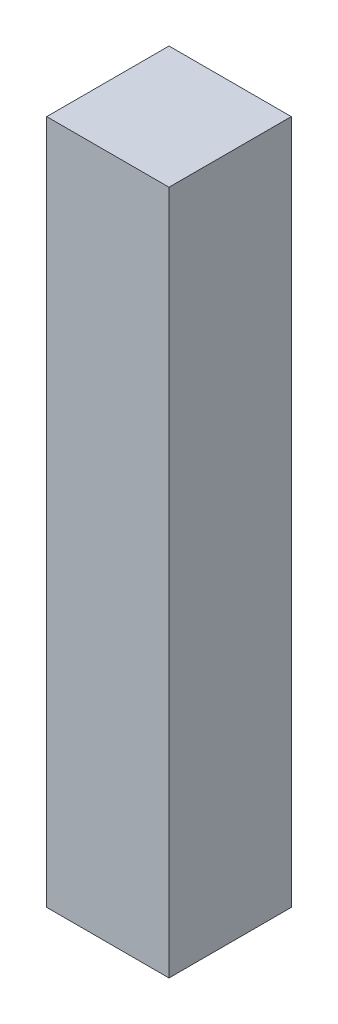
ISO-10303-21;
HEADER;
FILE_DESCRIPTION(('STEP AP214'),'2;1');
FILE_NAME('part.step','',(''),(''),'','','');
FILE_SCHEMA(('AUTOMOTIVE_DESIGN { 1 0 10303 214 1 1 1 1 }'));
ENDSEC;
DATA;
#1=APPLICATION_CONTEXT('core data for automotive mechanical design processes');
#2=APPLICATION_PROTOCOL_DEFINITION('international standard','automotive_design',2000,#1);
#3=PRODUCT_CONTEXT('',#1,'mechanical');
#4=PRODUCT('Part','Part','',(#3));
#5=PRODUCT_RELATED_PRODUCT_CATEGORY('part','',(#4));
#6=PRODUCT_DEFINITION_FORMATION('','',#4);
#7=PRODUCT_DEFINITION_CONTEXT('part definition',#1,'design');
#8=PRODUCT_DEFINITION('design','',#6,#7);
#9=PRODUCT_DEFINITION_SHAPE('','',#8);
#10=(LENGTH_UNIT() NAMED_UNIT(*) SI_UNIT(.MILLI.,.METRE.));
#11=(NAMED_UNIT(*) PLANE_ANGLE_UNIT() SI_UNIT($,.RADIAN.));
#12=(NAMED_UNIT(*) SI_UNIT($,.STERADIAN.) SOLID_ANGLE_UNIT());
#13=UNCERTAINTY_MEASURE_WITH_UNIT(LENGTH_MEASURE(1.E-05),#10,'distance_accuracy_value','');
#14=(GEOMETRIC_REPRESENTATION_CONTEXT(3) GLOBAL_UNCERTAINTY_ASSIGNED_CONTEXT((#13)) GLOBAL_UNIT_ASSIGNED_CONTEXT((#10,
#11,#12)) REPRESENTATION_CONTEXT('',''));
#15=CARTESIAN_POINT('',(0.,0.,0.));
#16=DIRECTION('',(0.,0.,1.));
#17=DIRECTION('',(1.,0.,0.));
#18=AXIS2_PLACEMENT_3D('',#15,#16,#17);
#19=CARTESIAN_POINT('',(0.,28.,5.));
#20=DIRECTION('',(1.,0.,0.));
#21=DIRECTION('',(0.,0.,-1.));
#22=AXIS2_PLACEMENT_3D('',#19,#20,#21);
#23=PLANE('',#22);
#24=DIRECTION('',(0.,-1.,0.));
#25=VECTOR('',#24,1.);
#26=CARTESIAN_POINT('',(0.,28.,0.));
#27=LINE('',#26,#25);
#28=CARTESIAN_POINT('',(0.,28.,0.));
#29=VERTEX_POINT('',#28);
#30=CARTESIAN_POINT('',(0.,0.,0.));
#31=VERTEX_POINT('',#30);
#32=EDGE_CURVE('E102',#29,#31,#27,.T.);
#33=ORIENTED_EDGE('',*,*,#32,.T.);
#34=DIRECTION('',(0.,0.,-1.));
#35=VECTOR('',#34,1.);
#36=CARTESIAN_POINT('',(0.,0.,5.));
#37=LINE('',#36,#35);
#38=CARTESIAN_POINT('',(0.,0.,5.));
#39=VERTEX_POINT('',#38);
#40=EDGE_CURVE('E11',#39,#31,#37,.T.);
#41=ORIENTED_EDGE('',*,*,#40,.F.);
#42=DIRECTION('',(0.,-1.,0.));
#43=VECTOR('',#42,1.);
#44=CARTESIAN_POINT('',(0.,28.,5.));
#45=LINE('',#44,#43);
#46=CARTESIAN_POINT('',(0.,28.,5.));
#47=VERTEX_POINT('',#46);
#48=EDGE_CURVE('E90',#47,#39,#45,.T.);
#49=ORIENTED_EDGE('',*,*,#48,.F.);
#50=DIRECTION('',(0.,0.,-1.));
#51=VECTOR('',#50,1.);
#52=CARTESIAN_POINT('',(0.,28.,5.));
#53=LINE('',#52,#51);
#54=EDGE_CURVE('E98',#47,#29,#53,.T.);
#55=ORIENTED_EDGE('',*,*,#54,.T.);
#56=EDGE_LOOP('',(#33,#41,#49,#55));
#57=FACE_BOUND('',#56,.T.);
#58=ADVANCED_FACE('F39',(#57),#23,.F.);
#59=CARTESIAN_POINT('',(0.,0.,5.));
#60=DIRECTION('',(0.,1.,0.));
#61=DIRECTION('',(0.,0.,1.));
#62=AXIS2_PLACEMENT_3D('',#59,#60,#61);
#63=PLANE('',#62);
#64=DIRECTION('',(1.,0.,0.));
#65=VECTOR('',#64,1.);
#66=CARTESIAN_POINT('',(0.,0.,0.));
#67=LINE('',#66,#65);
#68=CARTESIAN_POINT('',(5.,0.,0.));
#69=VERTEX_POINT('',#68);
#70=EDGE_CURVE('E94',#31,#69,#67,.T.);
#71=ORIENTED_EDGE('',*,*,#70,.T.);
#72=DIRECTION('',(0.,0.,-1.));
#73=VECTOR('',#72,1.);
#74=CARTESIAN_POINT('',(5.,0.,5.));
#75=LINE('',#74,#73);
#76=CARTESIAN_POINT('',(5.,0.,5.));
#77=VERTEX_POINT('',#76);
#78=EDGE_CURVE('E47',#77,#69,#75,.T.);
#79=ORIENTED_EDGE('',*,*,#78,.F.);
#80=DIRECTION('',(1.,0.,0.));
#81=VECTOR('',#80,1.);
#82=CARTESIAN_POINT('',(0.,0.,5.));
#83=LINE('',#82,#81);
#84=EDGE_CURVE('E85',#39,#77,#83,.T.);
#85=ORIENTED_EDGE('',*,*,#84,.F.);
#86=ORIENTED_EDGE('',*,*,#40,.T.);
#87=EDGE_LOOP('',(#71,#79,#85,#86));
#88=FACE_BOUND('',#87,.T.);
#89=ADVANCED_FACE('F93',(#88),#63,.F.);
#90=CARTESIAN_POINT('',(5.,0.,5.));
#91=DIRECTION('',(-1.,0.,0.));
#92=DIRECTION('',(0.,0.,1.));
#93=AXIS2_PLACEMENT_3D('',#90,#91,#92);
#94=PLANE('',#93);
#95=DIRECTION('',(0.,1.,0.));
#96=VECTOR('',#95,1.);
#97=CARTESIAN_POINT('',(5.,0.,0.));
#98=LINE('',#97,#96);
#99=CARTESIAN_POINT('',(5.,28.,0.));
#100=VERTEX_POINT('',#99);
#101=EDGE_CURVE('E72',#69,#100,#98,.T.);
#102=ORIENTED_EDGE('',*,*,#101,.T.);
#103=DIRECTION('',(0.,0.,-1.));
#104=VECTOR('',#103,1.);
#105=CARTESIAN_POINT('',(5.,28.,5.));
#106=LINE('',#105,#104);
#107=CARTESIAN_POINT('',(5.,28.,5.));
#108=VERTEX_POINT('',#107);
#109=EDGE_CURVE('E95',#108,#100,#106,.T.);
#110=ORIENTED_EDGE('',*,*,#109,.F.);
#111=DIRECTION('',(0.,1.,0.));
#112=VECTOR('',#111,1.);
#113=CARTESIAN_POINT('',(5.,0.,5.));
#114=LINE('',#113,#112);
#115=EDGE_CURVE('E88',#77,#108,#114,.T.);
#116=ORIENTED_EDGE('',*,*,#115,.F.);
#117=ORIENTED_EDGE('',*,*,#78,.T.);
#118=EDGE_LOOP('',(#102,#110,#116,#117));
#119=FACE_BOUND('',#118,.T.);
#120=ADVANCED_FACE('F96',(#119),#94,.F.);
#121=CARTESIAN_POINT('',(5.,28.,5.));
#122=DIRECTION('',(0.,-1.,0.));
#123=DIRECTION('',(1.,0.,0.));
#124=AXIS2_PLACEMENT_3D('',#121,#122,#123);
#125=PLANE('',#124);
#126=DIRECTION('',(-1.,0.,0.));
#127=VECTOR('',#126,1.);
#128=CARTESIAN_POINT('',(5.,28.,0.));
#129=LINE('',#128,#127);
#130=EDGE_CURVE('E78',#100,#29,#129,.T.);
#131=ORIENTED_EDGE('',*,*,#130,.T.);
#132=ORIENTED_EDGE('',*,*,#54,.F.);
#133=DIRECTION('',(-1.,0.,0.));
#134=VECTOR('',#133,1.);
#135=CARTESIAN_POINT('',(5.,28.,5.));
#136=LINE('',#135,#134);
#137=EDGE_CURVE('E55',#108,#47,#136,.T.);
#138=ORIENTED_EDGE('',*,*,#137,.F.);
#139=ORIENTED_EDGE('',*,*,#109,.T.);
#140=EDGE_LOOP('',(#131,#132,#138,#139));
#141=FACE_BOUND('',#140,.T.);
#142=ADVANCED_FACE('F109',(#141),#125,.F.);
#143=CARTESIAN_POINT('',(0.,0.,5.));
#144=DIRECTION('',(0.,0.,1.));
#145=DIRECTION('',(1.,0.,0.));
#146=AXIS2_PLACEMENT_3D('',#143,#144,#145);
#147=PLANE('',#146);
#148=ORIENTED_EDGE('',*,*,#48,.T.);
#149=ORIENTED_EDGE('',*,*,#84,.T.);
#150=ORIENTED_EDGE('',*,*,#115,.T.);
#151=ORIENTED_EDGE('',*,*,#137,.T.);
#152=EDGE_LOOP('',(#148,#149,#150,#151));
#153=FACE_BOUND('',#152,.T.);
#154=ADVANCED_FACE('F86',(#153),#147,.T.);
#155=CARTESIAN_POINT('',(0.,0.,0.));
#156=DIRECTION('',(0.,0.,1.));
#157=DIRECTION('',(1.,0.,0.));
#158=AXIS2_PLACEMENT_3D('',#155,#156,#157);
#159=PLANE('',#158);
#160=ORIENTED_EDGE('',*,*,#32,.F.);
#161=ORIENTED_EDGE('',*,*,#130,.F.);
#162=ORIENTED_EDGE('',*,*,#101,.F.);
#163=ORIENTED_EDGE('',*,*,#70,.F.);
#164=EDGE_LOOP('',(#160,#161,#162,#163));
#165=FACE_BOUND('',#164,.T.);
#166=ADVANCED_FACE('F112',(#165),#159,.F.);
#167=CLOSED_SHELL('',(#58,#89,#120,#142,#154,#166));
#168=MANIFOLD_SOLID_BREP('B2',#167);
#169=ADVANCED_BREP_SHAPE_REPRESENTATION('',(#18,#168),#14);
#170=SHAPE_DEFINITION_REPRESENTATION(#9,#169);
ENDSEC;
END-ISO-10303-21;
